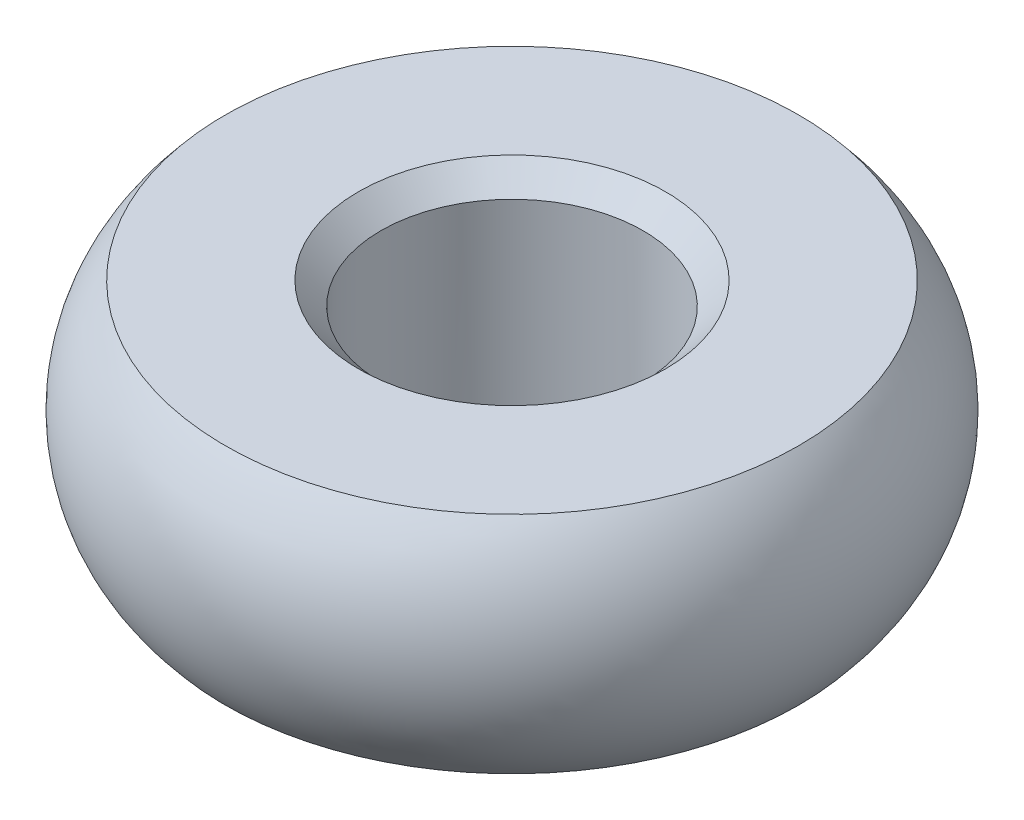
ISO-10303-21;
HEADER;
FILE_DESCRIPTION(('STEP AP214'),'2;1');
FILE_NAME('part.step','',(''),(''),'','','');
FILE_SCHEMA(('AUTOMOTIVE_DESIGN { 1 0 10303 214 1 1 1 1 }'));
ENDSEC;
DATA;
#1=APPLICATION_CONTEXT('core data for automotive mechanical design processes');
#2=APPLICATION_PROTOCOL_DEFINITION('international standard','automotive_design',2000,#1);
#3=PRODUCT_CONTEXT('',#1,'mechanical');
#4=PRODUCT('Part','Part','',(#3));
#5=PRODUCT_RELATED_PRODUCT_CATEGORY('part','',(#4));
#6=PRODUCT_DEFINITION_FORMATION('','',#4);
#7=PRODUCT_DEFINITION_CONTEXT('part definition',#1,'design');
#8=PRODUCT_DEFINITION('design','',#6,#7);
#9=PRODUCT_DEFINITION_SHAPE('','',#8);
#10=(LENGTH_UNIT() NAMED_UNIT(*) SI_UNIT(.MILLI.,.METRE.));
#11=(NAMED_UNIT(*) PLANE_ANGLE_UNIT() SI_UNIT($,.RADIAN.));
#12=(NAMED_UNIT(*) SI_UNIT($,.STERADIAN.) SOLID_ANGLE_UNIT());
#13=UNCERTAINTY_MEASURE_WITH_UNIT(LENGTH_MEASURE(1.E-05),#10,'distance_accuracy_value','');
#14=(GEOMETRIC_REPRESENTATION_CONTEXT(3) GLOBAL_UNCERTAINTY_ASSIGNED_CONTEXT((#13)) GLOBAL_UNIT_ASSIGNED_CONTEXT((#10,
#11,#12)) REPRESENTATION_CONTEXT('',''));
#15=CARTESIAN_POINT('',(0.,0.,0.));
#16=DIRECTION('',(0.,0.,1.));
#17=DIRECTION('',(1.,0.,0.));
#18=AXIS2_PLACEMENT_3D('',#15,#16,#17);
#19=CARTESIAN_POINT('',(17.5,15.,0.));
#20=DIRECTION('',(0.,1.,0.));
#21=DIRECTION('',(-1.,0.,0.));
#22=AXIS2_PLACEMENT_3D('',#19,#20,#21);
#23=PLANE('',#22);
#24=CARTESIAN_POINT('',(0.,14.9999999999999,0.));
#25=DIRECTION('',(0.,1.,0.));
#26=DIRECTION('',(-1.,0.,0.));
#27=AXIS2_PLACEMENT_3D('',#24,#25,#26);
#28=CIRCLE('',#27,20.5000000000001);
#29=CARTESIAN_POINT('',(-20.5000000000002,14.9999999999998,0.));
#30=VERTEX_POINT('',#29);
#31=EDGE_CURVE('E48',#30,#30,#28,.F.);
#32=ORIENTED_EDGE('',*,*,#31,.T.);
#33=EDGE_LOOP('',(#32));
#34=FACE_BOUND('',#33,.T.);
#35=CARTESIAN_POINT('',(0.,14.9999999999999,0.));
#36=DIRECTION('',(0.,-1.,0.));
#37=DIRECTION('',(1.,0.,0.));
#38=AXIS2_PLACEMENT_3D('',#35,#36,#37);
#39=CIRCLE('',#38,38.2705098312485);
#40=CARTESIAN_POINT('',(38.2705098312484,15.,0.));
#41=VERTEX_POINT('',#40);
#42=EDGE_CURVE('E53',#41,#41,#39,.T.);
#43=ORIENTED_EDGE('',*,*,#42,.F.);
#44=EDGE_LOOP('',(#43));
#45=FACE_BOUND('',#44,.T.);
#46=ADVANCED_FACE('F32',(#34,#45),#23,.T.);
#47=CARTESIAN_POINT('',(0.,-1.11022302462516E-13,0.));
#48=DIRECTION('',(0.,-1.,0.));
#49=DIRECTION('',(1.,0.,0.));
#50=AXIS2_PLACEMENT_3D('',#47,#48,#49);
#51=DEGENERATE_TOROIDAL_SURFACE('',#50,21.5,22.5,.T.);
#52=ORIENTED_EDGE('',*,*,#42,.T.);
#53=EDGE_LOOP('',(#52));
#54=FACE_BOUND('',#53,.T.);
#55=CARTESIAN_POINT('',(0.,-15.0000000000001,0.));
#56=DIRECTION('',(0.,-1.,0.));
#57=DIRECTION('',(1.,0.,0.));
#58=AXIS2_PLACEMENT_3D('',#55,#56,#57);
#59=CIRCLE('',#58,38.2705098312484);
#60=CARTESIAN_POINT('',(38.2705098312484,-15.,0.));
#61=VERTEX_POINT('',#60);
#62=EDGE_CURVE('E56',#61,#61,#59,.T.);
#63=ORIENTED_EDGE('',*,*,#62,.F.);
#64=EDGE_LOOP('',(#63));
#65=FACE_BOUND('',#64,.T.);
#66=ADVANCED_FACE('F62',(#54,#65),#51,.T.);
#67=CARTESIAN_POINT('',(17.5,-15.,0.));
#68=DIRECTION('',(0.,-1.,0.));
#69=DIRECTION('',(1.,0.,0.));
#70=AXIS2_PLACEMENT_3D('',#67,#68,#69);
#71=PLANE('',#70);
#72=CARTESIAN_POINT('',(0.,-15.0000000000001,0.));
#73=DIRECTION('',(0.,-1.,0.));
#74=DIRECTION('',(1.,0.,0.));
#75=AXIS2_PLACEMENT_3D('',#72,#73,#74);
#76=CIRCLE('',#75,20.4999999999999);
#77=CARTESIAN_POINT('',(20.5,-15.,0.));
#78=VERTEX_POINT('',#77);
#79=EDGE_CURVE('E10',#78,#78,#76,.F.);
#80=ORIENTED_EDGE('',*,*,#79,.T.);
#81=EDGE_LOOP('',(#80));
#82=FACE_BOUND('',#81,.T.);
#83=ORIENTED_EDGE('',*,*,#62,.T.);
#84=EDGE_LOOP('',(#83));
#85=FACE_BOUND('',#84,.T.);
#86=ADVANCED_FACE('F60',(#82,#85),#71,.T.);
#87=CARTESIAN_POINT('',(1.93062209184187E-12,-562.822725833894,0.));
#88=DIRECTION('',(0.,-1.,0.));
#89=DIRECTION('',(1.,0.,0.));
#90=AXIS2_PLACEMENT_3D('',#87,#88,#89);
#91=CYLINDRICAL_SURFACE('',#90,17.5);
#92=CARTESIAN_POINT('',(0.,11.9999999999998,0.));
#93=DIRECTION('',(0.,1.,0.));
#94=DIRECTION('',(-1.,0.,0.));
#95=AXIS2_PLACEMENT_3D('',#92,#93,#94);
#96=CIRCLE('',#95,17.5);
#97=CARTESIAN_POINT('',(-17.5,11.9999999999997,0.));
#98=VERTEX_POINT('',#97);
#99=EDGE_CURVE('E40',#98,#98,#96,.T.);
#100=ORIENTED_EDGE('',*,*,#99,.T.);
#101=EDGE_LOOP('',(#100));
#102=FACE_BOUND('',#101,.T.);
#103=CARTESIAN_POINT('',(0.,-12.0000000000002,0.));
#104=DIRECTION('',(0.,-1.,0.));
#105=DIRECTION('',(1.,0.,0.));
#106=AXIS2_PLACEMENT_3D('',#103,#104,#105);
#107=CIRCLE('',#106,17.5);
#108=CARTESIAN_POINT('',(17.5,-12.0000000000002,0.));
#109=VERTEX_POINT('',#108);
#110=EDGE_CURVE('E44',#109,#109,#107,.T.);
#111=ORIENTED_EDGE('',*,*,#110,.T.);
#112=EDGE_LOOP('',(#111));
#113=FACE_BOUND('',#112,.T.);
#114=ADVANCED_FACE('F70',(#102,#113),#91,.F.);
#115=CARTESIAN_POINT('',(0.,14.9999999999999,0.));
#116=DIRECTION('',(0.,1.,0.));
#117=DIRECTION('',(-1.,0.,0.));
#118=AXIS2_PLACEMENT_3D('',#115,#116,#117);
#119=CONICAL_SURFACE('',#118,20.5000000000001,0.785398163397446);
#120=ORIENTED_EDGE('',*,*,#99,.F.);
#121=EDGE_LOOP('',(#120));
#122=FACE_BOUND('',#121,.T.);
#123=ORIENTED_EDGE('',*,*,#31,.F.);
#124=EDGE_LOOP('',(#123));
#125=FACE_BOUND('',#124,.T.);
#126=ADVANCED_FACE('F76',(#122,#125),#119,.F.);
#127=CARTESIAN_POINT('',(0.,-12.0000000000002,0.));
#128=DIRECTION('',(0.,-1.,0.));
#129=DIRECTION('',(1.,0.,0.));
#130=AXIS2_PLACEMENT_3D('',#127,#128,#129);
#131=CONICAL_SURFACE('',#130,17.5,0.785398163397459);
#132=ORIENTED_EDGE('',*,*,#79,.F.);
#133=EDGE_LOOP('',(#132));
#134=FACE_BOUND('',#133,.T.);
#135=ORIENTED_EDGE('',*,*,#110,.F.);
#136=EDGE_LOOP('',(#135));
#137=FACE_BOUND('',#136,.T.);
#138=ADVANCED_FACE('F35',(#134,#137),#131,.F.);
#139=CLOSED_SHELL('',(#46,#66,#86,#114,#126,#138));
#140=MANIFOLD_SOLID_BREP('B2',#139);
#141=ADVANCED_BREP_SHAPE_REPRESENTATION('',(#18,#140),#14);
#142=SHAPE_DEFINITION_REPRESENTATION(#9,#141);
ENDSEC;
END-ISO-10303-21;
